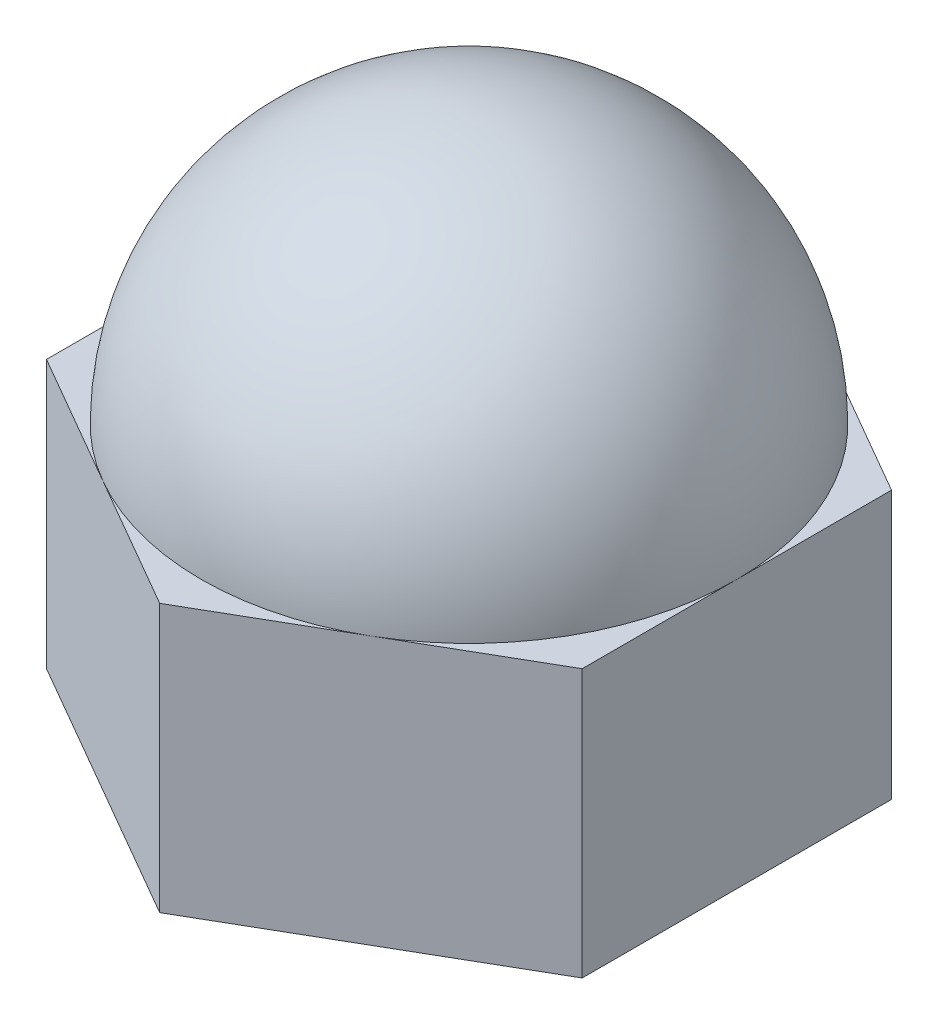
ISO-10303-21;
HEADER;
FILE_DESCRIPTION(('STEP AP214'),'2;1');
FILE_NAME('part.step','',(''),(''),'','','');
FILE_SCHEMA(('AUTOMOTIVE_DESIGN { 1 0 10303 214 1 1 1 1 }'));
ENDSEC;
DATA;
#1=APPLICATION_CONTEXT('core data for automotive mechanical design processes');
#2=APPLICATION_PROTOCOL_DEFINITION('international standard','automotive_design',2000,#1);
#3=PRODUCT_CONTEXT('',#1,'mechanical');
#4=PRODUCT('Part','Part','',(#3));
#5=PRODUCT_RELATED_PRODUCT_CATEGORY('part','',(#4));
#6=PRODUCT_DEFINITION_FORMATION('','',#4);
#7=PRODUCT_DEFINITION_CONTEXT('part definition',#1,'design');
#8=PRODUCT_DEFINITION('design','',#6,#7);
#9=PRODUCT_DEFINITION_SHAPE('','',#8);
#10=(LENGTH_UNIT() NAMED_UNIT(*) SI_UNIT(.MILLI.,.METRE.));
#11=(NAMED_UNIT(*) PLANE_ANGLE_UNIT() SI_UNIT($,.RADIAN.));
#12=(NAMED_UNIT(*) SI_UNIT($,.STERADIAN.) SOLID_ANGLE_UNIT());
#13=UNCERTAINTY_MEASURE_WITH_UNIT(LENGTH_MEASURE(1.E-05),#10,'distance_accuracy_value','');
#14=(GEOMETRIC_REPRESENTATION_CONTEXT(3) GLOBAL_UNCERTAINTY_ASSIGNED_CONTEXT((#13)) GLOBAL_UNIT_ASSIGNED_CONTEXT((#10,
#11,#12)) REPRESENTATION_CONTEXT('',''));
#15=CARTESIAN_POINT('',(0.,0.,0.));
#16=DIRECTION('',(0.,0.,1.));
#17=DIRECTION('',(1.,0.,0.));
#18=AXIS2_PLACEMENT_3D('',#15,#16,#17);
#19=CARTESIAN_POINT('',(0.,6.5,0.));
#20=DIRECTION('',(0.,1.,0.));
#21=DIRECTION('',(0.,0.,1.));
#22=AXIS2_PLACEMENT_3D('',#19,#20,#21);
#23=PLANE('',#22);
#24=DIRECTION('',(0.866025403784439,0.,0.499999999999999));
#25=VECTOR('',#24,1.);
#26=CARTESIAN_POINT('',(-6.5,6.5,3.75277674973257));
#27=LINE('',#26,#25);
#28=CARTESIAN_POINT('',(-6.5,6.5,3.75277674973257));
#29=VERTEX_POINT('',#28);
#30=CARTESIAN_POINT('',(-3.24999999999999,6.5,5.62916512459886));
#31=VERTEX_POINT('',#30);
#32=EDGE_CURVE('E178',#29,#31,#27,.T.);
#33=ORIENTED_EDGE('',*,*,#32,.T.);
#34=CARTESIAN_POINT('',(0.,6.5,0.));
#35=DIRECTION('',(0.,1.,0.));
#36=DIRECTION('',(0.,0.,1.));
#37=AXIS2_PLACEMENT_3D('',#34,#35,#36);
#38=CIRCLE('',#37,6.5);
#39=CARTESIAN_POINT('',(-6.5,6.5,0.));
#40=VERTEX_POINT('',#39);
#41=EDGE_CURVE('E11',#31,#40,#38,.F.);
#42=ORIENTED_EDGE('',*,*,#41,.T.);
#43=DIRECTION('',(0.,0.,1.));
#44=VECTOR('',#43,1.);
#45=CARTESIAN_POINT('',(-6.5,6.5,-3.75277674973256));
#46=LINE('',#45,#44);
#47=EDGE_CURVE('E57',#40,#29,#46,.T.);
#48=ORIENTED_EDGE('',*,*,#47,.T.);
#49=EDGE_LOOP('',(#33,#42,#48));
#50=FACE_BOUND('',#49,.T.);
#51=ADVANCED_FACE('F35',(#50),#23,.T.);
#52=CARTESIAN_POINT('',(-6.5,6.5,-3.75277674973256));
#53=VERTEX_POINT('',#52);
#54=EDGE_CURVE('E138',#53,#40,#46,.T.);
#55=ORIENTED_EDGE('',*,*,#54,.T.);
#56=CARTESIAN_POINT('',(-3.25,6.5,-5.62916512459885));
#57=VERTEX_POINT('',#56);
#58=EDGE_CURVE('E44',#40,#57,#38,.F.);
#59=ORIENTED_EDGE('',*,*,#58,.T.);
#60=DIRECTION('',(-0.866025403784439,0.,0.5));
#61=VECTOR('',#60,1.);
#62=CARTESIAN_POINT('',(0.,6.5,-7.50555349946513));
#63=LINE('',#62,#61);
#64=EDGE_CURVE('E136',#57,#53,#63,.T.);
#65=ORIENTED_EDGE('',*,*,#64,.T.);
#66=EDGE_LOOP('',(#55,#59,#65));
#67=FACE_BOUND('',#66,.T.);
#68=ADVANCED_FACE('F173',(#67),#23,.T.);
#69=CARTESIAN_POINT('',(0.,6.5,-7.50555349946513));
#70=VERTEX_POINT('',#69);
#71=EDGE_CURVE('E112',#70,#57,#63,.T.);
#72=ORIENTED_EDGE('',*,*,#71,.T.);
#73=CARTESIAN_POINT('',(3.25,6.5,-5.62916512459885));
#74=VERTEX_POINT('',#73);
#75=EDGE_CURVE('E115',#57,#74,#38,.F.);
#76=ORIENTED_EDGE('',*,*,#75,.T.);
#77=DIRECTION('',(-0.866025403784439,0.,-0.5));
#78=VECTOR('',#77,1.);
#79=CARTESIAN_POINT('',(6.5,6.5,-3.75277674973257));
#80=LINE('',#79,#78);
#81=EDGE_CURVE('E107',#74,#70,#80,.T.);
#82=ORIENTED_EDGE('',*,*,#81,.T.);
#83=EDGE_LOOP('',(#72,#76,#82));
#84=FACE_BOUND('',#83,.T.);
#85=ADVANCED_FACE('F109',(#84),#23,.T.);
#86=CARTESIAN_POINT('',(6.5,6.5,-3.75277674973257));
#87=VERTEX_POINT('',#86);
#88=EDGE_CURVE('E119',#87,#74,#80,.T.);
#89=ORIENTED_EDGE('',*,*,#88,.T.);
#90=CARTESIAN_POINT('',(6.5,6.5,0.));
#91=VERTEX_POINT('',#90);
#92=EDGE_CURVE('E165',#74,#91,#38,.F.);
#93=ORIENTED_EDGE('',*,*,#92,.T.);
#94=DIRECTION('',(0.,0.,-1.));
#95=VECTOR('',#94,1.);
#96=CARTESIAN_POINT('',(6.5,6.5,3.75277674973257));
#97=LINE('',#96,#95);
#98=EDGE_CURVE('E188',#91,#87,#97,.T.);
#99=ORIENTED_EDGE('',*,*,#98,.T.);
#100=EDGE_LOOP('',(#89,#93,#99));
#101=FACE_BOUND('',#100,.T.);
#102=ADVANCED_FACE('F194',(#101),#23,.T.);
#103=CARTESIAN_POINT('',(6.5,6.5,3.75277674973257));
#104=VERTEX_POINT('',#103);
#105=EDGE_CURVE('E120',#104,#91,#97,.T.);
#106=ORIENTED_EDGE('',*,*,#105,.T.);
#107=CARTESIAN_POINT('',(0.,6.5,0.));
#108=DIRECTION('',(0.,1.,0.));
#109=DIRECTION('',(0.,0.,1.));
#110=AXIS2_PLACEMENT_3D('',#107,#108,#109);
#111=CIRCLE('',#110,6.5);
#112=CARTESIAN_POINT('',(3.25,6.5,5.62916512459885));
#113=VERTEX_POINT('',#112);
#114=EDGE_CURVE('E148',#113,#91,#111,.T.);
#115=ORIENTED_EDGE('',*,*,#114,.F.);
#116=DIRECTION('',(0.866025403784439,0.,-0.5));
#117=VECTOR('',#116,1.);
#118=CARTESIAN_POINT('',(0.,6.5,7.50555349946513));
#119=LINE('',#118,#117);
#120=EDGE_CURVE('E182',#113,#104,#119,.T.);
#121=ORIENTED_EDGE('',*,*,#120,.T.);
#122=EDGE_LOOP('',(#106,#115,#121));
#123=FACE_BOUND('',#122,.T.);
#124=ADVANCED_FACE('F208',(#123),#23,.T.);
#125=CARTESIAN_POINT('',(-6.5,6.5,3.75277674973257));
#126=DIRECTION('',(0.499999999999999,0.,-0.866025403784439));
#127=DIRECTION('',(-0.866025403784439,0.,-0.499999999999999));
#128=AXIS2_PLACEMENT_3D('',#125,#126,#127);
#129=PLANE('',#128);
#130=DIRECTION('',(0.866025403784439,0.,0.499999999999999));
#131=VECTOR('',#130,1.);
#132=CARTESIAN_POINT('',(-6.5,0.,3.75277674973257));
#133=LINE('',#132,#131);
#134=CARTESIAN_POINT('',(-6.5,0.,3.75277674973257));
#135=VERTEX_POINT('',#134);
#136=CARTESIAN_POINT('',(0.,0.,7.50555349946513));
#137=VERTEX_POINT('',#136);
#138=EDGE_CURVE('E144',#135,#137,#133,.T.);
#139=ORIENTED_EDGE('',*,*,#138,.T.);
#140=DIRECTION('',(0.,-1.,0.));
#141=VECTOR('',#140,1.);
#142=CARTESIAN_POINT('',(0.,6.5,7.50555349946513));
#143=LINE('',#142,#141);
#144=CARTESIAN_POINT('',(0.,6.5,7.50555349946513));
#145=VERTEX_POINT('',#144);
#146=EDGE_CURVE('E161',#145,#137,#143,.T.);
#147=ORIENTED_EDGE('',*,*,#146,.F.);
#148=EDGE_CURVE('E93',#31,#145,#27,.T.);
#149=ORIENTED_EDGE('',*,*,#148,.F.);
#150=ORIENTED_EDGE('',*,*,#32,.F.);
#151=DIRECTION('',(0.,-1.,0.));
#152=VECTOR('',#151,1.);
#153=CARTESIAN_POINT('',(-6.5,6.5,3.75277674973257));
#154=LINE('',#153,#152);
#155=EDGE_CURVE('E143',#29,#135,#154,.T.);
#156=ORIENTED_EDGE('',*,*,#155,.T.);
#157=EDGE_LOOP('',(#139,#147,#149,#150,#156));
#158=FACE_BOUND('',#157,.T.);
#159=ADVANCED_FACE('F37',(#158),#129,.F.);
#160=CARTESIAN_POINT('',(0.,6.5,7.50555349946513));
#161=DIRECTION('',(-0.5,0.,-0.866025403784439));
#162=DIRECTION('',(-0.866025403784439,0.,0.5));
#163=AXIS2_PLACEMENT_3D('',#160,#161,#162);
#164=PLANE('',#163);
#165=DIRECTION('',(0.866025403784439,0.,-0.5));
#166=VECTOR('',#165,1.);
#167=CARTESIAN_POINT('',(0.,0.,7.50555349946513));
#168=LINE('',#167,#166);
#169=CARTESIAN_POINT('',(6.5,0.,3.75277674973257));
#170=VERTEX_POINT('',#169);
#171=EDGE_CURVE('E147',#137,#170,#168,.T.);
#172=ORIENTED_EDGE('',*,*,#171,.T.);
#173=DIRECTION('',(0.,-1.,0.));
#174=VECTOR('',#173,1.);
#175=CARTESIAN_POINT('',(6.5,6.5,3.75277674973257));
#176=LINE('',#175,#174);
#177=EDGE_CURVE('E159',#104,#170,#176,.T.);
#178=ORIENTED_EDGE('',*,*,#177,.F.);
#179=ORIENTED_EDGE('',*,*,#120,.F.);
#180=EDGE_CURVE('E184',#145,#113,#119,.T.);
#181=ORIENTED_EDGE('',*,*,#180,.F.);
#182=ORIENTED_EDGE('',*,*,#146,.T.);
#183=EDGE_LOOP('',(#172,#178,#179,#181,#182));
#184=FACE_BOUND('',#183,.T.);
#185=ADVANCED_FACE('F201',(#184),#164,.F.);
#186=CARTESIAN_POINT('',(6.5,6.5,3.75277674973257));
#187=DIRECTION('',(-1.,0.,0.));
#188=DIRECTION('',(0.,0.,1.));
#189=AXIS2_PLACEMENT_3D('',#186,#187,#188);
#190=PLANE('',#189);
#191=DIRECTION('',(0.,0.,-1.));
#192=VECTOR('',#191,1.);
#193=CARTESIAN_POINT('',(6.5,0.,3.75277674973257));
#194=LINE('',#193,#192);
#195=CARTESIAN_POINT('',(6.5,0.,-3.75277674973257));
#196=VERTEX_POINT('',#195);
#197=EDGE_CURVE('E150',#170,#196,#194,.T.);
#198=ORIENTED_EDGE('',*,*,#197,.T.);
#199=DIRECTION('',(0.,-1.,0.));
#200=VECTOR('',#199,1.);
#201=CARTESIAN_POINT('',(6.5,6.5,-3.75277674973257));
#202=LINE('',#201,#200);
#203=EDGE_CURVE('E130',#87,#196,#202,.T.);
#204=ORIENTED_EDGE('',*,*,#203,.F.);
#205=ORIENTED_EDGE('',*,*,#98,.F.);
#206=ORIENTED_EDGE('',*,*,#105,.F.);
#207=ORIENTED_EDGE('',*,*,#177,.T.);
#208=EDGE_LOOP('',(#198,#204,#205,#206,#207));
#209=FACE_BOUND('',#208,.T.);
#210=ADVANCED_FACE('F196',(#209),#190,.F.);
#211=CARTESIAN_POINT('',(6.5,6.5,-3.75277674973257));
#212=DIRECTION('',(-0.5,0.,0.866025403784439));
#213=DIRECTION('',(0.866025403784439,0.,0.5));
#214=AXIS2_PLACEMENT_3D('',#211,#212,#213);
#215=PLANE('',#214);
#216=DIRECTION('',(-0.866025403784439,0.,-0.5));
#217=VECTOR('',#216,1.);
#218=CARTESIAN_POINT('',(6.5,0.,-3.75277674973257));
#219=LINE('',#218,#217);
#220=CARTESIAN_POINT('',(0.,0.,-7.50555349946513));
#221=VERTEX_POINT('',#220);
#222=EDGE_CURVE('E127',#196,#221,#219,.T.);
#223=ORIENTED_EDGE('',*,*,#222,.T.);
#224=DIRECTION('',(0.,-1.,0.));
#225=VECTOR('',#224,1.);
#226=CARTESIAN_POINT('',(0.,6.5,-7.50555349946513));
#227=LINE('',#226,#225);
#228=EDGE_CURVE('E123',#70,#221,#227,.T.);
#229=ORIENTED_EDGE('',*,*,#228,.F.);
#230=ORIENTED_EDGE('',*,*,#81,.F.);
#231=ORIENTED_EDGE('',*,*,#88,.F.);
#232=ORIENTED_EDGE('',*,*,#203,.T.);
#233=EDGE_LOOP('',(#223,#229,#230,#231,#232));
#234=FACE_BOUND('',#233,.T.);
#235=ADVANCED_FACE('F124',(#234),#215,.F.);
#236=CARTESIAN_POINT('',(0.,6.5,-7.50555349946513));
#237=DIRECTION('',(0.5,0.,0.866025403784438));
#238=DIRECTION('',(0.866025403784438,0.,-0.5));
#239=AXIS2_PLACEMENT_3D('',#236,#237,#238);
#240=PLANE('',#239);
#241=DIRECTION('',(-0.866025403784439,0.,0.5));
#242=VECTOR('',#241,1.);
#243=CARTESIAN_POINT('',(0.,0.,-7.50555349946513));
#244=LINE('',#243,#242);
#245=CARTESIAN_POINT('',(-6.5,0.,-3.75277674973256));
#246=VERTEX_POINT('',#245);
#247=EDGE_CURVE('E153',#221,#246,#244,.T.);
#248=ORIENTED_EDGE('',*,*,#247,.T.);
#249=DIRECTION('',(0.,-1.,0.));
#250=VECTOR('',#249,1.);
#251=CARTESIAN_POINT('',(-6.5,6.5,-3.75277674973256));
#252=LINE('',#251,#250);
#253=EDGE_CURVE('E131',#53,#246,#252,.T.);
#254=ORIENTED_EDGE('',*,*,#253,.F.);
#255=ORIENTED_EDGE('',*,*,#64,.F.);
#256=ORIENTED_EDGE('',*,*,#71,.F.);
#257=ORIENTED_EDGE('',*,*,#228,.T.);
#258=EDGE_LOOP('',(#248,#254,#255,#256,#257));
#259=FACE_BOUND('',#258,.T.);
#260=ADVANCED_FACE('F134',(#259),#240,.F.);
#261=CARTESIAN_POINT('',(-6.5,6.5,-3.75277674973256));
#262=DIRECTION('',(1.,0.,0.));
#263=DIRECTION('',(0.,0.,-1.));
#264=AXIS2_PLACEMENT_3D('',#261,#262,#263);
#265=PLANE('',#264);
#266=DIRECTION('',(0.,0.,1.));
#267=VECTOR('',#266,1.);
#268=CARTESIAN_POINT('',(-6.5,0.,-3.75277674973256));
#269=LINE('',#268,#267);
#270=EDGE_CURVE('E85',#246,#135,#269,.T.);
#271=ORIENTED_EDGE('',*,*,#270,.T.);
#272=ORIENTED_EDGE('',*,*,#155,.F.);
#273=ORIENTED_EDGE('',*,*,#47,.F.);
#274=ORIENTED_EDGE('',*,*,#54,.F.);
#275=ORIENTED_EDGE('',*,*,#253,.T.);
#276=EDGE_LOOP('',(#271,#272,#273,#274,#275));
#277=FACE_BOUND('',#276,.T.);
#278=ADVANCED_FACE('F179',(#277),#265,.F.);
#279=ORIENTED_EDGE('',*,*,#180,.T.);
#280=EDGE_CURVE('E39',#113,#31,#38,.F.);
#281=ORIENTED_EDGE('',*,*,#280,.T.);
#282=ORIENTED_EDGE('',*,*,#148,.T.);
#283=EDGE_LOOP('',(#279,#281,#282));
#284=FACE_BOUND('',#283,.T.);
#285=ADVANCED_FACE('F205',(#284),#23,.T.);
#286=CARTESIAN_POINT('',(0.,0.,0.));
#287=DIRECTION('',(0.,1.,0.));
#288=DIRECTION('',(0.,0.,1.));
#289=AXIS2_PLACEMENT_3D('',#286,#287,#288);
#290=PLANE('',#289);
#291=CARTESIAN_POINT('',(0.,0.,0.));
#292=DIRECTION('',(0.,-1.,0.));
#293=DIRECTION('',(0.,0.,-1.));
#294=AXIS2_PLACEMENT_3D('',#291,#292,#293);
#295=CIRCLE('',#294,4.);
#296=CARTESIAN_POINT('',(0.,0.,-4.));
#297=VERTEX_POINT('',#296);
#298=EDGE_CURVE('E336',#297,#297,#295,.T.);
#299=ORIENTED_EDGE('',*,*,#298,.F.);
#300=EDGE_LOOP('',(#299));
#301=FACE_BOUND('',#300,.T.);
#302=ORIENTED_EDGE('',*,*,#138,.F.);
#303=ORIENTED_EDGE('',*,*,#270,.F.);
#304=ORIENTED_EDGE('',*,*,#247,.F.);
#305=ORIENTED_EDGE('',*,*,#222,.F.);
#306=ORIENTED_EDGE('',*,*,#197,.F.);
#307=ORIENTED_EDGE('',*,*,#171,.F.);
#308=EDGE_LOOP('',(#302,#303,#304,#305,#306,#307));
#309=FACE_BOUND('',#308,.T.);
#310=ADVANCED_FACE('F199',(#301,#309),#290,.F.);
#311=CARTESIAN_POINT('',(0.,6.5,0.));
#312=DIRECTION('',(0.,1.,0.));
#313=DIRECTION('',(1.,0.,0.));
#314=AXIS2_PLACEMENT_3D('',#311,#312,#313);
#315=SPHERICAL_SURFACE('',#314,6.5);
#316=ORIENTED_EDGE('',*,*,#114,.T.);
#317=ORIENTED_EDGE('',*,*,#92,.F.);
#318=ORIENTED_EDGE('',*,*,#75,.F.);
#319=ORIENTED_EDGE('',*,*,#58,.F.);
#320=ORIENTED_EDGE('',*,*,#41,.F.);
#321=ORIENTED_EDGE('',*,*,#280,.F.);
#322=EDGE_LOOP('',(#316,#317,#318,#319,#320,#321));
#323=FACE_BOUND('',#322,.T.);
#324=ADVANCED_FACE('F176',(#323),#315,.T.);
#325=CARTESIAN_POINT('',(0.,6.5,0.));
#326=DIRECTION('',(0.,-1.,0.));
#327=DIRECTION('',(0.,0.,-1.));
#328=AXIS2_PLACEMENT_3D('',#325,#326,#327);
#329=CYLINDRICAL_SURFACE('',#328,4.);
#330=CARTESIAN_POINT('',(0.,6.5,0.));
#331=DIRECTION('',(0.,-1.,0.));
#332=DIRECTION('',(0.,0.,-1.));
#333=AXIS2_PLACEMENT_3D('',#330,#331,#332);
#334=CIRCLE('',#333,4.);
#335=CARTESIAN_POINT('',(0.,6.5,-4.));
#336=VERTEX_POINT('',#335);
#337=EDGE_CURVE('E335',#336,#336,#334,.T.);
#338=CARTESIAN_POINT('',(0.,6.5,-4.));
#339=CARTESIAN_POINT('',(0.,6.43229166666667,-4.));
#340=CARTESIAN_POINT('',(0.,6.36458333333333,-4.));
#341=CARTESIAN_POINT('',(0.,6.22916666666667,-4.));
#342=CARTESIAN_POINT('',(0.,6.16145833333333,-4.));
#343=CARTESIAN_POINT('',(0.,6.02604166666667,-4.));
#344=CARTESIAN_POINT('',(0.,5.95833333333333,-4.));
#345=CARTESIAN_POINT('',(0.,5.82291666666667,-4.));
#346=CARTESIAN_POINT('',(0.,5.75520833333333,-4.));
#347=CARTESIAN_POINT('',(0.,5.61979166666667,-4.));
#348=CARTESIAN_POINT('',(0.,5.55208333333333,-4.));
#349=CARTESIAN_POINT('',(0.,5.41666666666667,-4.));
#350=CARTESIAN_POINT('',(0.,5.34895833333333,-4.));
#351=CARTESIAN_POINT('',(0.,5.21354166666667,-4.));
#352=CARTESIAN_POINT('',(0.,5.14583333333333,-4.));
#353=CARTESIAN_POINT('',(0.,5.01041666666667,-4.));
#354=CARTESIAN_POINT('',(0.,4.94270833333333,-4.));
#355=CARTESIAN_POINT('',(0.,4.80729166666667,-4.));
#356=CARTESIAN_POINT('',(0.,4.73958333333333,-4.));
#357=CARTESIAN_POINT('',(0.,4.60416666666667,-4.));
#358=CARTESIAN_POINT('',(0.,4.53645833333333,-4.));
#359=CARTESIAN_POINT('',(0.,4.40104166666667,-4.));
#360=CARTESIAN_POINT('',(0.,4.33333333333333,-4.));
#361=CARTESIAN_POINT('',(0.,4.19791666666667,-4.));
#362=CARTESIAN_POINT('',(0.,4.13020833333333,-4.));
#363=CARTESIAN_POINT('',(0.,3.99479166666667,-4.));
#364=CARTESIAN_POINT('',(0.,3.92708333333333,-4.));
#365=CARTESIAN_POINT('',(0.,3.79166666666667,-4.));
#366=CARTESIAN_POINT('',(0.,3.72395833333333,-4.));
#367=CARTESIAN_POINT('',(0.,3.58854166666667,-4.));
#368=CARTESIAN_POINT('',(0.,3.52083333333333,-4.));
#369=CARTESIAN_POINT('',(0.,3.38541666666667,-4.));
#370=CARTESIAN_POINT('',(0.,3.31770833333333,-4.));
#371=CARTESIAN_POINT('',(0.,3.18229166666667,-4.));
#372=CARTESIAN_POINT('',(0.,3.11458333333333,-4.));
#373=CARTESIAN_POINT('',(0.,2.97916666666667,-4.));
#374=CARTESIAN_POINT('',(0.,2.91145833333333,-4.));
#375=CARTESIAN_POINT('',(0.,2.77604166666667,-4.));
#376=CARTESIAN_POINT('',(0.,2.70833333333333,-4.));
#377=CARTESIAN_POINT('',(0.,2.57291666666667,-4.));
#378=CARTESIAN_POINT('',(0.,2.50520833333333,-4.));
#379=CARTESIAN_POINT('',(0.,2.36979166666667,-4.));
#380=CARTESIAN_POINT('',(0.,2.30208333333333,-4.));
#381=CARTESIAN_POINT('',(0.,2.16666666666667,-4.));
#382=CARTESIAN_POINT('',(0.,2.09895833333333,-4.));
#383=CARTESIAN_POINT('',(0.,1.96354166666667,-4.));
#384=CARTESIAN_POINT('',(0.,1.89583333333333,-4.));
#385=CARTESIAN_POINT('',(0.,1.76041666666667,-4.));
#386=CARTESIAN_POINT('',(0.,1.69270833333333,-4.));
#387=CARTESIAN_POINT('',(0.,1.55729166666667,-4.));
#388=CARTESIAN_POINT('',(0.,1.48958333333333,-4.));
#389=CARTESIAN_POINT('',(0.,1.35416666666667,-4.));
#390=CARTESIAN_POINT('',(0.,1.28645833333333,-4.));
#391=CARTESIAN_POINT('',(0.,1.15104166666667,-4.));
#392=CARTESIAN_POINT('',(0.,1.08333333333333,-4.));
#393=CARTESIAN_POINT('',(0.,0.947916666666667,-4.));
#394=CARTESIAN_POINT('',(0.,0.880208333333333,-4.));
#395=CARTESIAN_POINT('',(0.,0.744791666666667,-4.));
#396=CARTESIAN_POINT('',(0.,0.677083333333333,-4.));
#397=CARTESIAN_POINT('',(0.,0.541666666666667,-4.));
#398=CARTESIAN_POINT('',(0.,0.473958333333333,-4.));
#399=CARTESIAN_POINT('',(0.,0.338541666666667,-4.));
#400=CARTESIAN_POINT('',(0.,0.270833333333334,-4.));
#401=CARTESIAN_POINT('',(0.,0.135416666666667,-4.));
#402=CARTESIAN_POINT('',(0.,0.0677083333333334,-4.));
#403=CARTESIAN_POINT('',(0.,0.,-4.));
#404=B_SPLINE_CURVE_WITH_KNOTS('',3,(#338,#339,#340,#341,#342,#343,#344,#345,#346,#347,#348,
#349,#350,#351,#352,#353,#354,#355,#356,#357,#358,#359,#360,#361,#362,#363,#364,#365,#366,#367,
#368,#369,#370,#371,#372,#373,#374,#375,#376,#377,#378,#379,#380,#381,#382,#383,#384,#385,#386,
#387,#388,#389,#390,#391,#392,#393,#394,#395,#396,#397,#398,#399,#400,#401,#402,#403),
.UNSPECIFIED.,.F.,.F.,(4,2,2,2,2,2,2,2,2,2,2,2,2,2,2,2,2,2,2,2,2,2,2,2,2,2,2,2,2,2,2,2,4),(0.,
0.203124999999999,0.40625,0.609375,0.8125,1.015625,1.21875,1.421875,1.625,1.828125,2.03125,
2.234375,2.4375,2.640625,2.84375,3.046875,3.25,3.453125,3.65625,3.859375,4.0625,4.265625,
4.46875,4.671875,4.875,5.078125,5.28125,5.484375,5.6875,5.890625,6.09375,6.296875,6.5),.UNSPECIFIED.);
#405=EDGE_CURVE('BSEAM248',#336,#297,#404,.T.);
#406=ORIENTED_EDGE('',*,*,#337,.F.);
#407=ORIENTED_EDGE('',*,*,#298,.T.);
#408=ORIENTED_EDGE('',*,*,#405,.T.);
#409=ORIENTED_EDGE('',*,*,#405,.F.);
#410=EDGE_LOOP('',(#406,#408,#407,#409));
#411=FACE_BOUND('',#410,.T.);
#412=ADVANCED_FACE('F248',(#411),#329,.F.);
#413=CARTESIAN_POINT('',(0.,6.5,0.));
#414=DIRECTION('',(0.,-1.,0.));
#415=DIRECTION('',(0.,0.,-1.));
#416=AXIS2_PLACEMENT_3D('',#413,#414,#415);
#417=PLANE('',#416);
#418=ORIENTED_EDGE('',*,*,#337,.T.);
#419=EDGE_LOOP('',(#418));
#420=FACE_BOUND('',#419,.T.);
#421=ADVANCED_FACE('F256',(#420),#417,.T.);
#422=CLOSED_SHELL('',(#51,#68,#85,#102,#124,#159,#185,#210,#235,#260,#278,#285,#310,#324,#412,#421));
#423=MANIFOLD_SOLID_BREP('B2',#422);
#424=ADVANCED_BREP_SHAPE_REPRESENTATION('',(#18,#423),#14);
#425=SHAPE_DEFINITION_REPRESENTATION(#9,#424);
ENDSEC;
END-ISO-10303-21;
